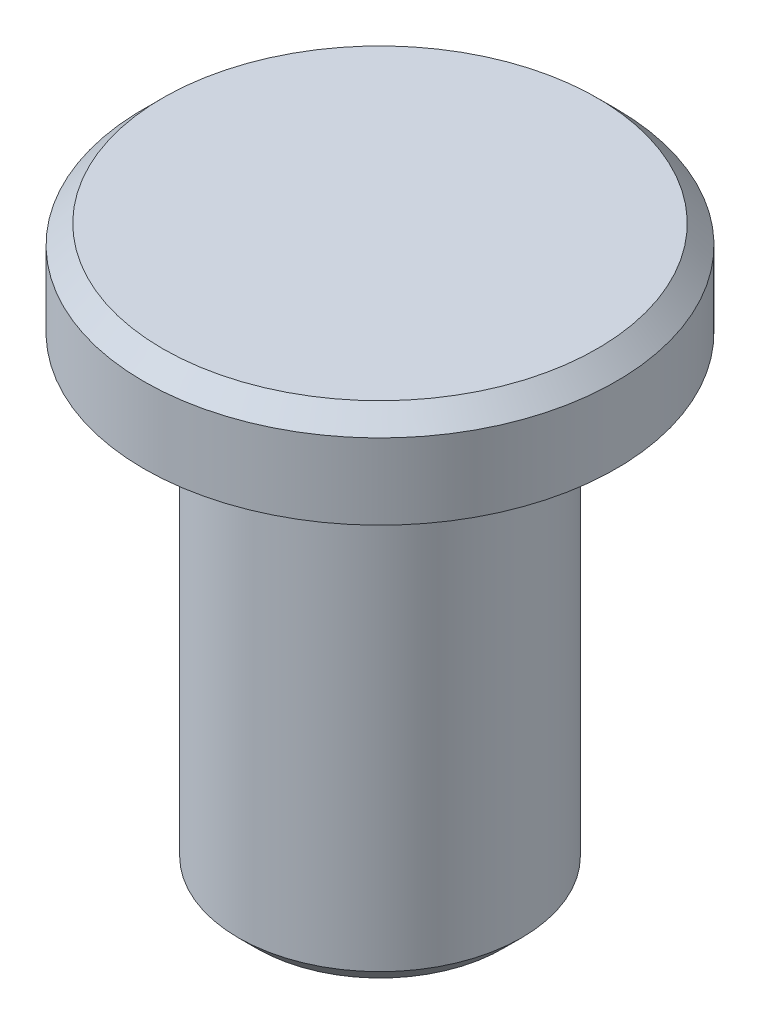
ISO-10303-21;
HEADER;
FILE_DESCRIPTION(('STEP AP214'),'2;1');
FILE_NAME('part.step','',(''),(''),'','','');
FILE_SCHEMA(('AUTOMOTIVE_DESIGN { 1 0 10303 214 1 1 1 1 }'));
ENDSEC;
DATA;
#1=APPLICATION_CONTEXT('core data for automotive mechanical design processes');
#2=APPLICATION_PROTOCOL_DEFINITION('international standard','automotive_design',2000,#1);
#3=PRODUCT_CONTEXT('',#1,'mechanical');
#4=PRODUCT('Part','Part','',(#3));
#5=PRODUCT_RELATED_PRODUCT_CATEGORY('part','',(#4));
#6=PRODUCT_DEFINITION_FORMATION('','',#4);
#7=PRODUCT_DEFINITION_CONTEXT('part definition',#1,'design');
#8=PRODUCT_DEFINITION('design','',#6,#7);
#9=PRODUCT_DEFINITION_SHAPE('','',#8);
#10=(LENGTH_UNIT() NAMED_UNIT(*) SI_UNIT(.MILLI.,.METRE.));
#11=(NAMED_UNIT(*) PLANE_ANGLE_UNIT() SI_UNIT($,.RADIAN.));
#12=(NAMED_UNIT(*) SI_UNIT($,.STERADIAN.) SOLID_ANGLE_UNIT());
#13=UNCERTAINTY_MEASURE_WITH_UNIT(LENGTH_MEASURE(1.E-05),#10,'distance_accuracy_value','');
#14=(GEOMETRIC_REPRESENTATION_CONTEXT(3) GLOBAL_UNCERTAINTY_ASSIGNED_CONTEXT((#13)) GLOBAL_UNIT_ASSIGNED_CONTEXT((#10,
#11,#12)) REPRESENTATION_CONTEXT('',''));
#15=CARTESIAN_POINT('',(0.,0.,0.));
#16=DIRECTION('',(0.,0.,1.));
#17=DIRECTION('',(1.,0.,0.));
#18=AXIS2_PLACEMENT_3D('',#15,#16,#17);
#19=CARTESIAN_POINT('',(1.5,0.,0.));
#20=DIRECTION('',(0.,-1.,0.));
#21=DIRECTION('',(0.,0.,-1.));
#22=AXIS2_PLACEMENT_3D('',#19,#20,#21);
#23=PLANE('',#22);
#24=CARTESIAN_POINT('',(0.,0.,0.));
#25=DIRECTION('',(0.,-1.,0.));
#26=DIRECTION('',(0.,0.,-1.));
#27=AXIS2_PLACEMENT_3D('',#24,#25,#26);
#28=CIRCLE('',#27,1.3);
#29=CARTESIAN_POINT('',(0.,0.,1.3));
#30=VERTEX_POINT('',#29);
#31=EDGE_CURVE('E51',#30,#30,#28,.T.);
#32=ORIENTED_EDGE('',*,*,#31,.T.);
#33=EDGE_LOOP('',(#32));
#34=FACE_BOUND('',#33,.T.);
#35=ADVANCED_FACE('F35',(#34),#23,.T.);
#36=CARTESIAN_POINT('',(0.,6.,0.));
#37=DIRECTION('',(0.,1.,0.));
#38=DIRECTION('',(0.,0.,1.));
#39=AXIS2_PLACEMENT_3D('',#36,#37,#38);
#40=PLANE('',#39);
#41=CARTESIAN_POINT('',(0.,6.,0.));
#42=DIRECTION('',(0.,1.,0.));
#43=DIRECTION('',(0.,0.,1.));
#44=AXIS2_PLACEMENT_3D('',#41,#42,#43);
#45=CIRCLE('',#44,2.3);
#46=CARTESIAN_POINT('',(0.,6.,2.3));
#47=VERTEX_POINT('',#46);
#48=EDGE_CURVE('E10',#47,#47,#45,.T.);
#49=ORIENTED_EDGE('',*,*,#48,.T.);
#50=EDGE_LOOP('',(#49));
#51=FACE_BOUND('',#50,.T.);
#52=ADVANCED_FACE('F77',(#51),#40,.T.);
#53=CARTESIAN_POINT('',(0.,0.,0.));
#54=DIRECTION('',(0.,-1.,0.));
#55=DIRECTION('',(0.,0.,-1.));
#56=AXIS2_PLACEMENT_3D('',#53,#54,#55);
#57=CYLINDRICAL_SURFACE('',#56,2.5);
#58=CARTESIAN_POINT('',(0.,5.8,0.));
#59=DIRECTION('',(0.,1.,0.));
#60=DIRECTION('',(0.,0.,1.));
#61=AXIS2_PLACEMENT_3D('',#58,#59,#60);
#62=CIRCLE('',#61,2.5);
#63=CARTESIAN_POINT('',(0.,5.8,2.5));
#64=VERTEX_POINT('',#63);
#65=EDGE_CURVE('E43',#64,#64,#62,.F.);
#66=ORIENTED_EDGE('',*,*,#65,.T.);
#67=EDGE_LOOP('',(#66));
#68=FACE_BOUND('',#67,.T.);
#69=CARTESIAN_POINT('',(0.,5.,0.));
#70=DIRECTION('',(0.,-1.,0.));
#71=DIRECTION('',(0.,0.,-1.));
#72=AXIS2_PLACEMENT_3D('',#69,#70,#71);
#73=CIRCLE('',#72,2.5);
#74=CARTESIAN_POINT('',(0.,5.,-2.5));
#75=VERTEX_POINT('',#74);
#76=EDGE_CURVE('E56',#75,#75,#73,.T.);
#77=ORIENTED_EDGE('',*,*,#76,.F.);
#78=EDGE_LOOP('',(#77));
#79=FACE_BOUND('',#78,.T.);
#80=ADVANCED_FACE('F67',(#68,#79),#57,.T.);
#81=CARTESIAN_POINT('',(2.5,5.,0.));
#82=DIRECTION('',(0.,-1.,0.));
#83=DIRECTION('',(0.,0.,-1.));
#84=AXIS2_PLACEMENT_3D('',#81,#82,#83);
#85=PLANE('',#84);
#86=ORIENTED_EDGE('',*,*,#76,.T.);
#87=EDGE_LOOP('',(#86));
#88=FACE_BOUND('',#87,.T.);
#89=CARTESIAN_POINT('',(0.,5.,0.));
#90=DIRECTION('',(0.,-1.,0.));
#91=DIRECTION('',(0.,0.,-1.));
#92=AXIS2_PLACEMENT_3D('',#89,#90,#91);
#93=CIRCLE('',#92,1.5);
#94=CARTESIAN_POINT('',(0.,5.,-1.5));
#95=VERTEX_POINT('',#94);
#96=EDGE_CURVE('E59',#95,#95,#93,.T.);
#97=ORIENTED_EDGE('',*,*,#96,.F.);
#98=EDGE_LOOP('',(#97));
#99=FACE_BOUND('',#98,.T.);
#100=ADVANCED_FACE('F65',(#88,#99),#85,.T.);
#101=CARTESIAN_POINT('',(0.,0.,0.));
#102=DIRECTION('',(0.,-1.,0.));
#103=DIRECTION('',(0.,0.,-1.));
#104=AXIS2_PLACEMENT_3D('',#101,#102,#103);
#105=CYLINDRICAL_SURFACE('',#104,1.5);
#106=CARTESIAN_POINT('',(0.,0.2,0.));
#107=DIRECTION('',(0.,-1.,0.));
#108=DIRECTION('',(0.,0.,-1.));
#109=AXIS2_PLACEMENT_3D('',#106,#107,#108);
#110=CIRCLE('',#109,1.5);
#111=CARTESIAN_POINT('',(0.,0.2,1.5));
#112=VERTEX_POINT('',#111);
#113=EDGE_CURVE('E47',#112,#112,#110,.F.);
#114=ORIENTED_EDGE('',*,*,#113,.T.);
#115=EDGE_LOOP('',(#114));
#116=FACE_BOUND('',#115,.T.);
#117=ORIENTED_EDGE('',*,*,#96,.T.);
#118=EDGE_LOOP('',(#117));
#119=FACE_BOUND('',#118,.T.);
#120=ADVANCED_FACE('F63',(#116,#119),#105,.T.);
#121=CARTESIAN_POINT('',(0.,0.,0.));
#122=DIRECTION('',(0.,1.,0.));
#123=DIRECTION('',(0.,0.,1.));
#124=AXIS2_PLACEMENT_3D('',#121,#122,#123);
#125=CONICAL_SURFACE('',#124,1.3,0.785398163397447);
#126=CARTESIAN_POINT('',(0.,0.2,1.5));
#127=CARTESIAN_POINT('',(0.,0.197916666666667,1.49791666666667));
#128=CARTESIAN_POINT('',(0.,0.195833333333333,1.49583333333333));
#129=CARTESIAN_POINT('',(0.,0.191666666666667,1.49166666666667));
#130=CARTESIAN_POINT('',(0.,0.189583333333333,1.48958333333333));
#131=CARTESIAN_POINT('',(0.,0.185416666666667,1.48541666666667));
#132=CARTESIAN_POINT('',(0.,0.183333333333333,1.48333333333333));
#133=CARTESIAN_POINT('',(0.,0.179166666666667,1.47916666666667));
#134=CARTESIAN_POINT('',(0.,0.177083333333333,1.47708333333333));
#135=CARTESIAN_POINT('',(0.,0.172916666666667,1.47291666666667));
#136=CARTESIAN_POINT('',(0.,0.170833333333333,1.47083333333333));
#137=CARTESIAN_POINT('',(0.,0.166666666666667,1.46666666666667));
#138=CARTESIAN_POINT('',(0.,0.164583333333333,1.46458333333333));
#139=CARTESIAN_POINT('',(0.,0.160416666666667,1.46041666666667));
#140=CARTESIAN_POINT('',(0.,0.158333333333333,1.45833333333333));
#141=CARTESIAN_POINT('',(0.,0.154166666666667,1.45416666666667));
#142=CARTESIAN_POINT('',(0.,0.152083333333333,1.45208333333333));
#143=CARTESIAN_POINT('',(0.,0.147916666666667,1.44791666666667));
#144=CARTESIAN_POINT('',(0.,0.145833333333333,1.44583333333333));
#145=CARTESIAN_POINT('',(0.,0.141666666666667,1.44166666666667));
#146=CARTESIAN_POINT('',(0.,0.139583333333333,1.43958333333333));
#147=CARTESIAN_POINT('',(0.,0.135416666666667,1.43541666666667));
#148=CARTESIAN_POINT('',(0.,0.133333333333333,1.43333333333333));
#149=CARTESIAN_POINT('',(0.,0.129166666666667,1.42916666666667));
#150=CARTESIAN_POINT('',(0.,0.127083333333333,1.42708333333333));
#151=CARTESIAN_POINT('',(0.,0.122916666666667,1.42291666666667));
#152=CARTESIAN_POINT('',(0.,0.120833333333333,1.42083333333333));
#153=CARTESIAN_POINT('',(0.,0.116666666666667,1.41666666666667));
#154=CARTESIAN_POINT('',(0.,0.114583333333333,1.41458333333333));
#155=CARTESIAN_POINT('',(0.,0.110416666666667,1.41041666666667));
#156=CARTESIAN_POINT('',(0.,0.108333333333333,1.40833333333333));
#157=CARTESIAN_POINT('',(0.,0.104166666666667,1.40416666666667));
#158=CARTESIAN_POINT('',(0.,0.102083333333333,1.40208333333333));
#159=CARTESIAN_POINT('',(0.,0.0979166666666666,1.39791666666667));
#160=CARTESIAN_POINT('',(0.,0.0958333333333333,1.39583333333333));
#161=CARTESIAN_POINT('',(0.,0.0916666666666666,1.39166666666667));
#162=CARTESIAN_POINT('',(0.,0.0895833333333333,1.38958333333333));
#163=CARTESIAN_POINT('',(0.,0.0854166666666667,1.38541666666667));
#164=CARTESIAN_POINT('',(0.,0.0833333333333333,1.38333333333333));
#165=CARTESIAN_POINT('',(0.,0.0791666666666666,1.37916666666667));
#166=CARTESIAN_POINT('',(0.,0.0770833333333333,1.37708333333333));
#167=CARTESIAN_POINT('',(0.,0.0729166666666666,1.37291666666667));
#168=CARTESIAN_POINT('',(0.,0.0708333333333333,1.37083333333333));
#169=CARTESIAN_POINT('',(0.,0.0666666666666666,1.36666666666667));
#170=CARTESIAN_POINT('',(0.,0.0645833333333333,1.36458333333333));
#171=CARTESIAN_POINT('',(0.,0.0604166666666666,1.36041666666667));
#172=CARTESIAN_POINT('',(0.,0.0583333333333333,1.35833333333333));
#173=CARTESIAN_POINT('',(0.,0.0541666666666666,1.35416666666667));
#174=CARTESIAN_POINT('',(0.,0.0520833333333333,1.35208333333333));
#175=CARTESIAN_POINT('',(0.,0.0479166666666666,1.34791666666667));
#176=CARTESIAN_POINT('',(0.,0.0458333333333333,1.34583333333333));
#177=CARTESIAN_POINT('',(0.,0.0416666666666666,1.34166666666667));
#178=CARTESIAN_POINT('',(0.,0.0395833333333333,1.33958333333333));
#179=CARTESIAN_POINT('',(0.,0.0354166666666666,1.33541666666667));
#180=CARTESIAN_POINT('',(0.,0.0333333333333333,1.33333333333333));
#181=CARTESIAN_POINT('',(0.,0.0291666666666666,1.32916666666667));
#182=CARTESIAN_POINT('',(0.,0.0270833333333333,1.32708333333333));
#183=CARTESIAN_POINT('',(0.,0.0229166666666667,1.32291666666667));
#184=CARTESIAN_POINT('',(0.,0.0208333333333333,1.32083333333333));
#185=CARTESIAN_POINT('',(0.,0.0166666666666666,1.31666666666667));
#186=CARTESIAN_POINT('',(0.,0.0145833333333333,1.31458333333333));
#187=CARTESIAN_POINT('',(0.,0.0104166666666667,1.31041666666667));
#188=CARTESIAN_POINT('',(0.,0.00833333333333332,1.30833333333333));
#189=CARTESIAN_POINT('',(0.,0.00416666666666665,1.30416666666667));
#190=CARTESIAN_POINT('',(0.,0.00208333333333331,1.30208333333333));
#191=CARTESIAN_POINT('',(0.,0.,1.3));
#192=B_SPLINE_CURVE_WITH_KNOTS('',3,(#126,#127,#128,#129,#130,#131,#132,#133,#134,#135,#136,
#137,#138,#139,#140,#141,#142,#143,#144,#145,#146,#147,#148,#149,#150,#151,#152,#153,#154,#155,
#156,#157,#158,#159,#160,#161,#162,#163,#164,#165,#166,#167,#168,#169,#170,#171,#172,#173,#174,
#175,#176,#177,#178,#179,#180,#181,#182,#183,#184,#185,#186,#187,#188,#189,#190,#191),
.UNSPECIFIED.,.F.,.F.,(4,2,2,2,2,2,2,2,2,2,2,2,2,2,2,2,2,2,2,2,2,2,2,2,2,2,2,2,2,2,2,2,4),(0.,
0.00883883476483181,0.0176776695296636,0.0265165042944954,0.0353553390593273,0.0441941738241591,
0.0530330085889909,0.0618718433538227,0.0707106781186545,0.0795495128834865,0.0883883476483183,
0.0972271824131501,0.106066017177982,0.114904851942814,0.123743686707646,0.132582521472477,
0.141421356237309,0.150260191002141,0.159099025766973,0.167937860531805,0.176776695296637,
0.185615530061468,0.1944543648263,0.203293199591132,0.212132034355964,0.220970869120796,
0.229809703885627,0.238648538650459,0.247487373415291,0.256326208180123,0.265165042944955,
0.274003877709787,0.282842712474618),.UNSPECIFIED.);
#193=EDGE_CURVE('BSEAM74',#112,#30,#192,.T.);
#194=ORIENTED_EDGE('',*,*,#113,.F.);
#195=ORIENTED_EDGE('',*,*,#31,.F.);
#196=ORIENTED_EDGE('',*,*,#193,.T.);
#197=ORIENTED_EDGE('',*,*,#193,.F.);
#198=EDGE_LOOP('',(#194,#196,#195,#197));
#199=FACE_BOUND('',#198,.T.);
#200=ADVANCED_FACE('F74',(#199),#125,.T.);
#201=CARTESIAN_POINT('',(0.,5.8,0.));
#202=DIRECTION('',(0.,-1.,0.));
#203=DIRECTION('',(0.,0.,-1.));
#204=AXIS2_PLACEMENT_3D('',#201,#202,#203);
#205=CONICAL_SURFACE('',#204,2.5,0.785398163397455);
#206=ORIENTED_EDGE('',*,*,#48,.F.);
#207=EDGE_LOOP('',(#206));
#208=FACE_BOUND('',#207,.T.);
#209=ORIENTED_EDGE('',*,*,#65,.F.);
#210=EDGE_LOOP('',(#209));
#211=FACE_BOUND('',#210,.T.);
#212=ADVANCED_FACE('F38',(#208,#211),#205,.T.);
#213=CLOSED_SHELL('',(#35,#52,#80,#100,#120,#200,#212));
#214=MANIFOLD_SOLID_BREP('B2',#213);
#215=ADVANCED_BREP_SHAPE_REPRESENTATION('',(#18,#214),#14);
#216=SHAPE_DEFINITION_REPRESENTATION(#9,#215);
ENDSEC;
END-ISO-10303-21;
